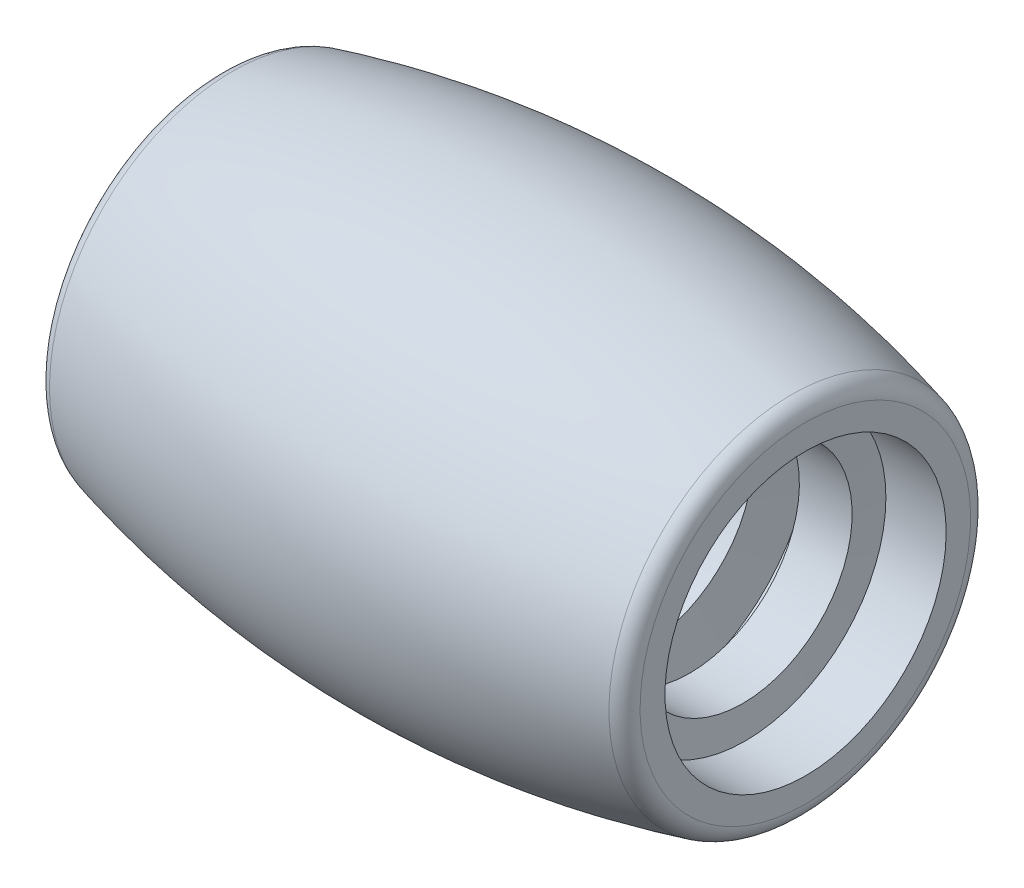
ISO-10303-21;
HEADER;
FILE_DESCRIPTION(('STEP AP214'),'2;1');
FILE_NAME('part.step','',(''),(''),'','','');
FILE_SCHEMA(('AUTOMOTIVE_DESIGN { 1 0 10303 214 1 1 1 1 }'));
ENDSEC;
DATA;
#1=APPLICATION_CONTEXT('core data for automotive mechanical design processes');
#2=APPLICATION_PROTOCOL_DEFINITION('international standard','automotive_design',2000,#1);
#3=PRODUCT_CONTEXT('',#1,'mechanical');
#4=PRODUCT('Part','Part','',(#3));
#5=PRODUCT_RELATED_PRODUCT_CATEGORY('part','',(#4));
#6=PRODUCT_DEFINITION_FORMATION('','',#4);
#7=PRODUCT_DEFINITION_CONTEXT('part definition',#1,'design');
#8=PRODUCT_DEFINITION('design','',#6,#7);
#9=PRODUCT_DEFINITION_SHAPE('','',#8);
#10=(LENGTH_UNIT() NAMED_UNIT(*) SI_UNIT(.MILLI.,.METRE.));
#11=(NAMED_UNIT(*) PLANE_ANGLE_UNIT() SI_UNIT($,.RADIAN.));
#12=(NAMED_UNIT(*) SI_UNIT($,.STERADIAN.) SOLID_ANGLE_UNIT());
#13=UNCERTAINTY_MEASURE_WITH_UNIT(LENGTH_MEASURE(1.E-05),#10,'distance_accuracy_value','');
#14=(GEOMETRIC_REPRESENTATION_CONTEXT(3) GLOBAL_UNCERTAINTY_ASSIGNED_CONTEXT((#13)) GLOBAL_UNIT_ASSIGNED_CONTEXT((#10,
#11,#12)) REPRESENTATION_CONTEXT('',''));
#15=CARTESIAN_POINT('',(0.,0.,0.));
#16=DIRECTION('',(0.,0.,1.));
#17=DIRECTION('',(1.,0.,0.));
#18=AXIS2_PLACEMENT_3D('',#15,#16,#17);
#19=CARTESIAN_POINT('',(-0.500000000009494,24.,0.));
#20=DIRECTION('',(1.,0.,0.));
#21=DIRECTION('',(0.,1.,0.));
#22=AXIS2_PLACEMENT_3D('',#19,#20,#21);
#23=CONICAL_SURFACE('',#22,4.49999999993486,1.48352986419883);
#24=CARTESIAN_POINT('',(-0.500000000000004,24.,0.));
#25=DIRECTION('',(-1.,0.,0.));
#26=DIRECTION('',(0.,-1.,0.));
#27=AXIS2_PLACEMENT_3D('',#24,#25,#26);
#28=CIRCLE('',#27,4.5);
#29=CARTESIAN_POINT('',(-0.500000000000002,19.5,0.));
#30=VERTEX_POINT('',#29);
#31=EDGE_CURVE('E19',#30,#30,#28,.F.);
#32=ORIENTED_EDGE('',*,*,#31,.T.);
#33=EDGE_LOOP('',(#32));
#34=FACE_BOUND('',#33,.T.);
#35=CARTESIAN_POINT('',(-0.63123299528889,24.,0.));
#36=DIRECTION('',(-1.,0.,0.));
#37=DIRECTION('',(0.,-1.,0.));
#38=AXIS2_PLACEMENT_3D('',#35,#36,#37);
#39=CIRCLE('',#38,3.);
#40=CARTESIAN_POINT('',(-0.631232995288888,21.,0.));
#41=VERTEX_POINT('',#40);
#42=EDGE_CURVE('E91',#41,#41,#39,.T.);
#43=ORIENTED_EDGE('',*,*,#42,.T.);
#44=EDGE_LOOP('',(#43));
#45=FACE_BOUND('',#44,.T.);
#46=ADVANCED_FACE('F15',(#34,#45),#23,.F.);
#47=CARTESIAN_POINT('',(0.,24.,0.));
#48=DIRECTION('',(-1.,0.,0.));
#49=DIRECTION('',(0.,-1.,0.));
#50=AXIS2_PLACEMENT_3D('',#47,#48,#49);
#51=CYLINDRICAL_SURFACE('',#50,4.5);
#52=CARTESIAN_POINT('',(0.500000000009494,24.,0.));
#53=DIRECTION('',(-1.,0.,0.));
#54=DIRECTION('',(0.,0.577765549497541,0.816202774936354));
#55=AXIS2_PLACEMENT_3D('',#52,#53,#54);
#56=CIRCLE('',#55,4.49999999993591);
#57=CARTESIAN_POINT('',(0.500000000009493,26.5999449727019,3.67291248716128));
#58=VERTEX_POINT('',#57);
#59=EDGE_CURVE('E89',#58,#58,#56,.F.);
#60=ORIENTED_EDGE('',*,*,#59,.T.);
#61=EDGE_LOOP('',(#60));
#62=FACE_BOUND('',#61,.T.);
#63=ORIENTED_EDGE('',*,*,#31,.F.);
#64=EDGE_LOOP('',(#63));
#65=FACE_BOUND('',#64,.T.);
#66=ADVANCED_FACE('F99',(#62,#65),#51,.F.);
#67=CARTESIAN_POINT('',(-2.05,24.,0.));
#68=DIRECTION('',(-1.,0.,0.));
#69=DIRECTION('',(0.,-1.,0.));
#70=AXIS2_PLACEMENT_3D('',#67,#68,#69);
#71=CYLINDRICAL_SURFACE('',#70,3.);
#72=ORIENTED_EDGE('',*,*,#42,.F.);
#73=EDGE_LOOP('',(#72));
#74=FACE_BOUND('',#73,.T.);
#75=CARTESIAN_POINT('',(-3.46876700471199,24.,0.));
#76=DIRECTION('',(-1.,0.,0.));
#77=DIRECTION('',(0.,0.577765549500587,0.816202774934198));
#78=AXIS2_PLACEMENT_3D('',#75,#76,#77);
#79=CIRCLE('',#78,2.99999999994198);
#80=CARTESIAN_POINT('',(-3.46876700471199,25.7332966484682,2.44860832475524));
#81=VERTEX_POINT('',#80);
#82=EDGE_CURVE('E86',#81,#81,#79,.T.);
#83=ORIENTED_EDGE('',*,*,#82,.T.);
#84=EDGE_LOOP('',(#83));
#85=FACE_BOUND('',#84,.T.);
#86=ADVANCED_FACE('F101',(#74,#85),#71,.F.);
#87=CARTESIAN_POINT('',(0.50000000003081,24.,0.));
#88=DIRECTION('',(-1.,0.,0.));
#89=DIRECTION('',(0.,-1.,0.));
#90=AXIS2_PLACEMENT_3D('',#87,#88,#89);
#91=CONICAL_SURFACE('',#90,4.49999999973104,1.48352986420108);
#92=ORIENTED_EDGE('',*,*,#59,.F.);
#93=EDGE_LOOP('',(#92));
#94=FACE_BOUND('',#93,.T.);
#95=CARTESIAN_POINT('',(0.631232995288883,24.,0.));
#96=DIRECTION('',(-1.,0.,0.));
#97=DIRECTION('',(0.,-1.,0.));
#98=AXIS2_PLACEMENT_3D('',#95,#96,#97);
#99=CIRCLE('',#98,3.);
#100=CARTESIAN_POINT('',(0.631232995288884,21.,0.));
#101=VERTEX_POINT('',#100);
#102=EDGE_CURVE('E83',#101,#101,#99,.F.);
#103=ORIENTED_EDGE('',*,*,#102,.T.);
#104=EDGE_LOOP('',(#103));
#105=FACE_BOUND('',#104,.T.);
#106=ADVANCED_FACE('F109',(#94,#105),#91,.F.);
#107=CARTESIAN_POINT('',(-3.59999999999871,24.,0.));
#108=DIRECTION('',(-1.,0.,0.));
#109=DIRECTION('',(0.,-1.,0.));
#110=AXIS2_PLACEMENT_3D('',#107,#108,#109);
#111=CONICAL_SURFACE('',#110,4.49999999993591,1.48352986419615);
#112=CARTESIAN_POINT('',(-3.6,24.,0.));
#113=DIRECTION('',(-1.,0.,0.));
#114=DIRECTION('',(0.,-1.,0.));
#115=AXIS2_PLACEMENT_3D('',#112,#113,#114);
#116=CIRCLE('',#115,4.5);
#117=CARTESIAN_POINT('',(-3.6,19.5,0.));
#118=VERTEX_POINT('',#117);
#119=EDGE_CURVE('E80',#118,#118,#116,.T.);
#120=ORIENTED_EDGE('',*,*,#119,.T.);
#121=EDGE_LOOP('',(#120));
#122=FACE_BOUND('',#121,.T.);
#123=ORIENTED_EDGE('',*,*,#82,.F.);
#124=EDGE_LOOP('',(#123));
#125=FACE_BOUND('',#124,.T.);
#126=ADVANCED_FACE('F186',(#122,#125),#111,.F.);
#127=CARTESIAN_POINT('',(2.05,24.,0.));
#128=DIRECTION('',(-1.,0.,0.));
#129=DIRECTION('',(0.,-1.,0.));
#130=AXIS2_PLACEMENT_3D('',#127,#128,#129);
#131=CYLINDRICAL_SURFACE('',#130,3.);
#132=ORIENTED_EDGE('',*,*,#102,.F.);
#133=EDGE_LOOP('',(#132));
#134=FACE_BOUND('',#133,.T.);
#135=CARTESIAN_POINT('',(3.46876700471199,24.,0.));
#136=DIRECTION('',(1.,0.,0.));
#137=DIRECTION('',(0.,-0.577765549500183,-0.816202774934484));
#138=AXIS2_PLACEMENT_3D('',#135,#136,#137);
#139=CIRCLE('',#138,2.99999999994093);
#140=CARTESIAN_POINT('',(3.46876700471199,22.2667033515336,-2.44860832475524));
#141=VERTEX_POINT('',#140);
#142=EDGE_CURVE('E77',#141,#141,#139,.T.);
#143=ORIENTED_EDGE('',*,*,#142,.T.);
#144=EDGE_LOOP('',(#143));
#145=FACE_BOUND('',#144,.T.);
#146=ADVANCED_FACE('F182',(#134,#145),#131,.F.);
#147=CARTESIAN_POINT('',(-4.1,24.,0.));
#148=DIRECTION('',(-1.,0.,0.));
#149=DIRECTION('',(0.,-1.,0.));
#150=AXIS2_PLACEMENT_3D('',#147,#148,#149);
#151=CYLINDRICAL_SURFACE('',#150,4.5);
#152=CARTESIAN_POINT('',(-4.60000000000349,24.,0.));
#153=DIRECTION('',(1.,0.,0.));
#154=DIRECTION('',(0.,-0.577765549497271,-0.816202774936545));
#155=AXIS2_PLACEMENT_3D('',#152,#153,#154);
#156=CIRCLE('',#155,4.49999999993486);
#157=CARTESIAN_POINT('',(-4.60000000000349,21.4000550272999,-3.67291248716128));
#158=VERTEX_POINT('',#157);
#159=EDGE_CURVE('E74',#158,#158,#156,.F.);
#160=ORIENTED_EDGE('',*,*,#159,.T.);
#161=EDGE_LOOP('',(#160));
#162=FACE_BOUND('',#161,.T.);
#163=ORIENTED_EDGE('',*,*,#119,.F.);
#164=EDGE_LOOP('',(#163));
#165=FACE_BOUND('',#164,.T.);
#166=ADVANCED_FACE('F178',(#162,#165),#151,.F.);
#167=CARTESIAN_POINT('',(3.60000000001293,24.,0.));
#168=DIRECTION('',(1.,0.,0.));
#169=DIRECTION('',(0.,1.,0.));
#170=AXIS2_PLACEMENT_3D('',#167,#168,#169);
#171=CONICAL_SURFACE('',#170,4.50000000009334,1.48352986419592);
#172=ORIENTED_EDGE('',*,*,#142,.F.);
#173=EDGE_LOOP('',(#172));
#174=FACE_BOUND('',#173,.T.);
#175=CARTESIAN_POINT('',(3.6,24.,0.));
#176=DIRECTION('',(-1.,0.,0.));
#177=DIRECTION('',(0.,-1.,0.));
#178=AXIS2_PLACEMENT_3D('',#175,#176,#177);
#179=CIRCLE('',#178,4.5);
#180=CARTESIAN_POINT('',(3.6,19.5,0.));
#181=VERTEX_POINT('',#180);
#182=EDGE_CURVE('E71',#181,#181,#179,.F.);
#183=ORIENTED_EDGE('',*,*,#182,.T.);
#184=EDGE_LOOP('',(#183));
#185=FACE_BOUND('',#184,.T.);
#186=ADVANCED_FACE('F174',(#174,#185),#171,.F.);
#187=CARTESIAN_POINT('',(-4.60000000000349,24.,0.));
#188=DIRECTION('',(1.,0.,0.));
#189=DIRECTION('',(0.,1.,0.));
#190=AXIS2_PLACEMENT_3D('',#187,#188,#189);
#191=CONICAL_SURFACE('',#190,4.49999999993486,1.48352986419144);
#192=ORIENTED_EDGE('',*,*,#159,.F.);
#193=EDGE_LOOP('',(#192));
#194=FACE_BOUND('',#193,.T.);
#195=CARTESIAN_POINT('',(-4.73123299528888,24.,0.));
#196=DIRECTION('',(-1.,0.,0.));
#197=DIRECTION('',(0.,-1.,0.));
#198=AXIS2_PLACEMENT_3D('',#195,#196,#197);
#199=CIRCLE('',#198,3.);
#200=CARTESIAN_POINT('',(-4.73123299528888,21.,0.));
#201=VERTEX_POINT('',#200);
#202=EDGE_CURVE('E68',#201,#201,#199,.T.);
#203=ORIENTED_EDGE('',*,*,#202,.T.);
#204=EDGE_LOOP('',(#203));
#205=FACE_BOUND('',#204,.T.);
#206=ADVANCED_FACE('F170',(#194,#205),#191,.F.);
#207=CARTESIAN_POINT('',(4.1,24.,0.));
#208=DIRECTION('',(-1.,0.,0.));
#209=DIRECTION('',(0.,-1.,0.));
#210=AXIS2_PLACEMENT_3D('',#207,#208,#209);
#211=CYLINDRICAL_SURFACE('',#210,4.5);
#212=CARTESIAN_POINT('',(4.60000000000349,24.,0.));
#213=DIRECTION('',(-1.,0.,0.));
#214=DIRECTION('',(0.,0.57776554949754,0.816202774936354));
#215=AXIS2_PLACEMENT_3D('',#212,#213,#214);
#216=CIRCLE('',#215,4.49999999993591);
#217=CARTESIAN_POINT('',(4.60000000000349,26.5999449727019,3.67291248716128));
#218=VERTEX_POINT('',#217);
#219=EDGE_CURVE('E65',#218,#218,#216,.F.);
#220=ORIENTED_EDGE('',*,*,#219,.T.);
#221=EDGE_LOOP('',(#220));
#222=FACE_BOUND('',#221,.T.);
#223=ORIENTED_EDGE('',*,*,#182,.F.);
#224=EDGE_LOOP('',(#223));
#225=FACE_BOUND('',#224,.T.);
#226=ADVANCED_FACE('F166',(#222,#225),#211,.F.);
#227=CARTESIAN_POINT('',(-5.45343381564592,24.,0.));
#228=DIRECTION('',(-1.,0.,0.));
#229=DIRECTION('',(0.,-1.,0.));
#230=AXIS2_PLACEMENT_3D('',#227,#228,#229);
#231=CYLINDRICAL_SURFACE('',#230,3.);
#232=ORIENTED_EDGE('',*,*,#202,.F.);
#233=EDGE_LOOP('',(#232));
#234=FACE_BOUND('',#233,.T.);
#235=CARTESIAN_POINT('',(-6.17563463599424,24.,0.));
#236=DIRECTION('',(-1.,0.,0.));
#237=DIRECTION('',(0.,0.577765549491652,0.816202774940523));
#238=AXIS2_PLACEMENT_3D('',#235,#236,#237);
#239=CIRCLE('',#238,2.99999999998838);
#240=CARTESIAN_POINT('',(-6.17563463599424,25.7332966484682,2.44860832481208));
#241=VERTEX_POINT('',#240);
#242=EDGE_CURVE('E62',#241,#241,#239,.T.);
#243=ORIENTED_EDGE('',*,*,#242,.T.);
#244=EDGE_LOOP('',(#243));
#245=FACE_BOUND('',#244,.T.);
#246=ADVANCED_FACE('F162',(#234,#245),#231,.F.);
#247=CARTESIAN_POINT('',(4.60000000000349,24.,0.));
#248=DIRECTION('',(-1.,0.,0.));
#249=DIRECTION('',(0.,-1.,0.));
#250=AXIS2_PLACEMENT_3D('',#247,#248,#249);
#251=CONICAL_SURFACE('',#250,4.49999999993591,1.48352986419144);
#252=ORIENTED_EDGE('',*,*,#219,.F.);
#253=EDGE_LOOP('',(#252));
#254=FACE_BOUND('',#253,.T.);
#255=CARTESIAN_POINT('',(4.73123299528889,24.,0.));
#256=DIRECTION('',(-1.,0.,0.));
#257=DIRECTION('',(0.,-1.,0.));
#258=AXIS2_PLACEMENT_3D('',#255,#256,#257);
#259=CIRCLE('',#258,3.);
#260=CARTESIAN_POINT('',(4.73123299528889,21.,0.));
#261=VERTEX_POINT('',#260);
#262=EDGE_CURVE('E59',#261,#261,#259,.F.);
#263=ORIENTED_EDGE('',*,*,#262,.T.);
#264=EDGE_LOOP('',(#263));
#265=FACE_BOUND('',#264,.T.);
#266=ADVANCED_FACE('F158',(#254,#265),#251,.F.);
#267=CARTESIAN_POINT('',(-6.24999999998721,24.,0.));
#268=DIRECTION('',(-1.,0.,0.));
#269=DIRECTION('',(0.,-1.,0.));
#270=AXIS2_PLACEMENT_3D('',#267,#268,#269);
#271=CONICAL_SURFACE('',#270,3.84999999999493,1.4835298642006);
#272=CARTESIAN_POINT('',(-6.25,24.,0.));
#273=DIRECTION('',(-1.,0.,0.));
#274=DIRECTION('',(0.,-1.,0.));
#275=AXIS2_PLACEMENT_3D('',#272,#273,#274);
#276=CIRCLE('',#275,3.85);
#277=CARTESIAN_POINT('',(-6.25,20.15,0.));
#278=VERTEX_POINT('',#277);
#279=EDGE_CURVE('E56',#278,#278,#276,.T.);
#280=ORIENTED_EDGE('',*,*,#279,.T.);
#281=EDGE_LOOP('',(#280));
#282=FACE_BOUND('',#281,.T.);
#283=ORIENTED_EDGE('',*,*,#242,.F.);
#284=EDGE_LOOP('',(#283));
#285=FACE_BOUND('',#284,.T.);
#286=ADVANCED_FACE('F154',(#282,#285),#271,.F.);
#287=CARTESIAN_POINT('',(5.45343381564592,24.,0.));
#288=DIRECTION('',(-1.,0.,0.));
#289=DIRECTION('',(0.,-1.,0.));
#290=AXIS2_PLACEMENT_3D('',#287,#288,#289);
#291=CYLINDRICAL_SURFACE('',#290,3.);
#292=ORIENTED_EDGE('',*,*,#262,.F.);
#293=EDGE_LOOP('',(#292));
#294=FACE_BOUND('',#293,.T.);
#295=CARTESIAN_POINT('',(6.17563463599424,24.,0.));
#296=DIRECTION('',(1.,0.,0.));
#297=DIRECTION('',(0.,-0.577765549487561,-0.816202774943419));
#298=AXIS2_PLACEMENT_3D('',#295,#296,#297);
#299=CIRCLE('',#298,2.99999999990809);
#300=CARTESIAN_POINT('',(6.17563463599424,22.2667033515904,-2.44860832475524));
#301=VERTEX_POINT('',#300);
#302=EDGE_CURVE('E53',#301,#301,#299,.T.);
#303=ORIENTED_EDGE('',*,*,#302,.T.);
#304=EDGE_LOOP('',(#303));
#305=FACE_BOUND('',#304,.T.);
#306=ADVANCED_FACE('F150',(#294,#305),#291,.F.);
#307=CARTESIAN_POINT('',(-6.71387324356678,24.,0.));
#308=DIRECTION('',(-1.,0.,0.));
#309=DIRECTION('',(0.,-1.,0.));
#310=AXIS2_PLACEMENT_3D('',#307,#308,#309);
#311=CYLINDRICAL_SURFACE('',#310,3.85);
#312=CARTESIAN_POINT('',(-7.17774648713831,24.,0.));
#313=DIRECTION('',(1.,0.,0.));
#314=DIRECTION('',(0.,-0.577765549497167,-0.816202774936619));
#315=AXIS2_PLACEMENT_3D('',#312,#313,#314);
#316=CIRCLE('',#315,3.85000000002672);
#317=CARTESIAN_POINT('',(-7.17774648713831,21.7756026344205,-3.14238068352779));
#318=VERTEX_POINT('',#317);
#319=EDGE_CURVE('E50',#318,#318,#316,.F.);
#320=ORIENTED_EDGE('',*,*,#319,.T.);
#321=EDGE_LOOP('',(#320));
#322=FACE_BOUND('',#321,.T.);
#323=ORIENTED_EDGE('',*,*,#279,.F.);
#324=EDGE_LOOP('',(#323));
#325=FACE_BOUND('',#324,.T.);
#326=ADVANCED_FACE('F146',(#322,#325),#311,.F.);
#327=CARTESIAN_POINT('',(6.24999999999431,24.,0.));
#328=DIRECTION('',(1.,0.,0.));
#329=DIRECTION('',(0.,1.,0.));
#330=AXIS2_PLACEMENT_3D('',#327,#328,#329);
#331=CONICAL_SURFACE('',#330,3.84999999999388,1.4835298642004);
#332=CARTESIAN_POINT('',(6.25,24.,0.));
#333=DIRECTION('',(-1.,0.,0.));
#334=DIRECTION('',(0.,-1.,0.));
#335=AXIS2_PLACEMENT_3D('',#332,#333,#334);
#336=CIRCLE('',#335,3.85000000000001);
#337=CARTESIAN_POINT('',(6.25,20.15,0.));
#338=VERTEX_POINT('',#337);
#339=EDGE_CURVE('E47',#338,#338,#336,.F.);
#340=ORIENTED_EDGE('',*,*,#339,.T.);
#341=EDGE_LOOP('',(#340));
#342=FACE_BOUND('',#341,.T.);
#343=ORIENTED_EDGE('',*,*,#302,.F.);
#344=EDGE_LOOP('',(#343));
#345=FACE_BOUND('',#344,.T.);
#346=ADVANCED_FACE('F142',(#342,#345),#331,.F.);
#347=CARTESIAN_POINT('',(-7.17774648713831,24.,0.));
#348=DIRECTION('',(1.,0.,0.));
#349=DIRECTION('',(0.,1.,0.));
#350=AXIS2_PLACEMENT_3D('',#347,#348,#349);
#351=CONICAL_SURFACE('',#350,3.85000000002672,1.5620696805395);
#352=ORIENTED_EDGE('',*,*,#319,.F.);
#353=EDGE_LOOP('',(#352));
#354=FACE_BOUND('',#353,.T.);
#355=CARTESIAN_POINT('',(-7.19520022271509,24.,0.));
#356=DIRECTION('',(-1.,0.,0.));
#357=DIRECTION('',(0.,-1.,0.));
#358=AXIS2_PLACEMENT_3D('',#355,#356,#357);
#359=CIRCLE('',#358,1.85);
#360=CARTESIAN_POINT('',(-7.19520022271509,22.15,0.));
#361=VERTEX_POINT('',#360);
#362=EDGE_CURVE('E44',#361,#361,#359,.T.);
#363=ORIENTED_EDGE('',*,*,#362,.T.);
#364=EDGE_LOOP('',(#363));
#365=FACE_BOUND('',#364,.T.);
#366=ADVANCED_FACE('F138',(#354,#365),#351,.F.);
#367=CARTESIAN_POINT('',(7.075,24.,0.));
#368=DIRECTION('',(-1.,0.,0.));
#369=DIRECTION('',(0.,-1.,0.));
#370=AXIS2_PLACEMENT_3D('',#367,#368,#369);
#371=CYLINDRICAL_SURFACE('',#370,3.85000000000001);
#372=ORIENTED_EDGE('',*,*,#339,.F.);
#373=EDGE_LOOP('',(#372));
#374=FACE_BOUND('',#373,.T.);
#375=CARTESIAN_POINT('',(7.89999999999758,24.,0.));
#376=DIRECTION('',(-1.,0.,0.));
#377=DIRECTION('',(0.,0.577765549497482,0.816202774936396));
#378=AXIS2_PLACEMENT_3D('',#375,#376,#377);
#379=CIRCLE('',#378,3.85000000002777);
#380=CARTESIAN_POINT('',(7.89999999999758,26.2243973655814,3.14238068352779));
#381=VERTEX_POINT('',#380);
#382=EDGE_CURVE('E41',#381,#381,#379,.T.);
#383=ORIENTED_EDGE('',*,*,#382,.F.);
#384=EDGE_LOOP('',(#383));
#385=FACE_BOUND('',#384,.T.);
#386=ADVANCED_FACE('F134',(#374,#385),#371,.F.);
#387=CARTESIAN_POINT('',(-7.69520022271509,24.,0.));
#388=DIRECTION('',(-1.,0.,0.));
#389=DIRECTION('',(0.,-1.,0.));
#390=AXIS2_PLACEMENT_3D('',#387,#388,#389);
#391=CYLINDRICAL_SURFACE('',#390,1.85);
#392=ORIENTED_EDGE('',*,*,#362,.F.);
#393=EDGE_LOOP('',(#392));
#394=FACE_BOUND('',#393,.T.);
#395=CARTESIAN_POINT('',(-8.19520022270837,24.,0.));
#396=DIRECTION('',(1.,0.,0.));
#397=DIRECTION('',(0.,-0.577765549493382,-0.816202774939298));
#398=AXIS2_PLACEMENT_3D('',#395,#396,#397);
#399=CIRCLE('',#398,1.84999999990275);
#400=CARTESIAN_POINT('',(-8.19520022270837,22.9311337334934,-1.50997513355833));
#401=VERTEX_POINT('',#400);
#402=EDGE_CURVE('E38',#401,#401,#399,.T.);
#403=ORIENTED_EDGE('',*,*,#402,.F.);
#404=EDGE_LOOP('',(#403));
#405=FACE_BOUND('',#404,.T.);
#406=ADVANCED_FACE('F130',(#394,#405),#391,.F.);
#407=CARTESIAN_POINT('',(7.89409753136727,24.,0.));
#408=DIRECTION('',(-1.,0.,0.));
#409=DIRECTION('',(0.,-1.,0.));
#410=AXIS2_PLACEMENT_3D('',#407,#408,#409);
#411=CONICAL_SURFACE('',#410,4.52635591323686,1.56206968054082);
#412=ORIENTED_EDGE('',*,*,#382,.T.);
#413=EDGE_LOOP('',(#412));
#414=FACE_BOUND('',#413,.T.);
#415=CARTESIAN_POINT('',(7.89409753136414,24.,0.));
#416=DIRECTION('',(-1.,0.,0.));
#417=DIRECTION('',(0.,-0.577765549498243,-0.816202774935857));
#418=AXIS2_PLACEMENT_3D('',#415,#416,#417);
#419=CIRCLE('',#418,4.52635591341328);
#420=CARTESIAN_POINT('',(7.89409753136415,21.3848274884622,-3.69442425687525));
#421=VERTEX_POINT('',#420);
#422=EDGE_CURVE('E35',#421,#421,#419,.T.);
#423=ORIENTED_EDGE('',*,*,#422,.F.);
#424=EDGE_LOOP('',(#423));
#425=FACE_BOUND('',#424,.T.);
#426=ADVANCED_FACE('F126',(#414,#425),#411,.T.);
#427=CARTESIAN_POINT('',(-8.17184401849947,24.,0.));
#428=DIRECTION('',(1.,0.,0.));
#429=DIRECTION('',(0.,1.,0.));
#430=AXIS2_PLACEMENT_3D('',#427,#428,#429);
#431=CONICAL_SURFACE('',#430,4.52635591397606,1.56206968054017);
#432=ORIENTED_EDGE('',*,*,#402,.T.);
#433=EDGE_LOOP('',(#432));
#434=FACE_BOUND('',#433,.T.);
#435=CARTESIAN_POINT('',(-8.17184401849288,24.,0.));
#436=DIRECTION('',(1.,0.,0.));
#437=DIRECTION('',(0.,-0.577765549498242,-0.816202774935858));
#438=AXIS2_PLACEMENT_3D('',#435,#436,#437);
#439=CIRCLE('',#438,4.52635591396764);
#440=CARTESIAN_POINT('',(-8.17184401849288,21.3848274881419,-3.69442425732772));
#441=VERTEX_POINT('',#440);
#442=EDGE_CURVE('E28',#441,#441,#439,.T.);
#443=ORIENTED_EDGE('',*,*,#442,.F.);
#444=EDGE_LOOP('',(#443));
#445=FACE_BOUND('',#444,.T.);
#446=ADVANCED_FACE('F123',(#434,#445),#431,.T.);
#447=CARTESIAN_POINT('',(7.3941165698333,24.,0.));
#448=DIRECTION('',(-1.,0.,0.));
#449=DIRECTION('',(0.,-1.,0.));
#450=AXIS2_PLACEMENT_3D('',#447,#448,#449);
#451=TOROIDAL_SURFACE('',#450,4.521992645522,0.499999999999998);
#452=ORIENTED_EDGE('',*,*,#422,.T.);
#453=EDGE_LOOP('',(#452));
#454=FACE_BOUND('',#453,.T.);
#455=CARTESIAN_POINT('',(7.52179436328076,24.,0.));
#456=DIRECTION('',(-1.,0.,0.));
#457=DIRECTION('',(0.,0.577765549498242,0.816202774935857));
#458=AXIS2_PLACEMENT_3D('',#455,#456,#457);
#459=CIRCLE('',#458,5.0054162496834);
#460=CARTESIAN_POINT('',(7.52179436328076,26.8919570699658,4.08543463270063));
#461=VERTEX_POINT('',#460);
#462=EDGE_CURVE('E23',#461,#461,#459,.T.);
#463=ORIENTED_EDGE('',*,*,#462,.F.);
#464=EDGE_LOOP('',(#463));
#465=FACE_BOUND('',#464,.T.);
#466=ADVANCED_FACE('F120',(#454,#465),#451,.T.);
#467=CARTESIAN_POINT('',(-7.67186305696688,24.,0.));
#468=DIRECTION('',(-1.,0.,0.));
#469=DIRECTION('',(0.,-1.,0.));
#470=AXIS2_PLACEMENT_3D('',#467,#468,#469);
#471=TOROIDAL_SURFACE('',#470,4.521992645522,0.499999999999997);
#472=ORIENTED_EDGE('',*,*,#442,.T.);
#473=EDGE_LOOP('',(#472));
#474=FACE_BOUND('',#473,.T.);
#475=CARTESIAN_POINT('',(-7.79954085041433,24.,0.));
#476=DIRECTION('',(-1.,0.,0.));
#477=DIRECTION('',(0.,0.577765549498242,0.816202774935857));
#478=AXIS2_PLACEMENT_3D('',#475,#476,#477);
#479=CIRCLE('',#478,5.0054162496834);
#480=CARTESIAN_POINT('',(-7.79954085041433,26.8919570699658,4.08543463270063));
#481=VERTEX_POINT('',#480);
#482=EDGE_CURVE('E10',#481,#481,#479,.F.);
#483=ORIENTED_EDGE('',*,*,#482,.F.);
#484=EDGE_LOOP('',(#483));
#485=FACE_BOUND('',#484,.T.);
#486=ADVANCED_FACE('F17',(#474,#485),#471,.T.);
#487=CARTESIAN_POINT('',(-0.138873243566783,10.1336268120421,-19.5888665984607));
#488=DIRECTION('',(0.,0.816202774935857,-0.577765549498242));
#489=DIRECTION('',(0.,0.577765549498242,0.816202774935857));
#490=AXIS2_PLACEMENT_3D('',#487,#488,#489);
#491=CIRCLE('',#490,30.0000000000002);
#492=TRIMMED_CURVE('',#491,(PARAMETER_VALUE(-0.643501108793283)),
(PARAMETER_VALUE(0.643501108793284)),.T.,.PARAMETER.);
#493=CARTESIAN_POINT('',(-0.138873243566788,24.,0.));
#494=DIRECTION('',(-1.,0.,0.));
#495=AXIS1_PLACEMENT('',#493,#494);
#496=SURFACE_OF_REVOLUTION('',#492,#495);
#497=ORIENTED_EDGE('',*,*,#462,.T.);
#498=EDGE_LOOP('',(#497));
#499=FACE_BOUND('',#498,.T.);
#500=ORIENTED_EDGE('',*,*,#482,.T.);
#501=EDGE_LOOP('',(#500));
#502=FACE_BOUND('',#501,.T.);
#503=ADVANCED_FACE('F113',(#499,#502),#496,.F.);
#504=CLOSED_SHELL('',(#46,#66,#86,#106,#126,#146,#166,#186,#206,#226,#246,#266,#286,#306,#326,
#346,#366,#386,#406,#426,#446,#466,#486,#503));
#505=MANIFOLD_SOLID_BREP('B1',#504);
#506=ADVANCED_BREP_SHAPE_REPRESENTATION('',(#18,#505),#14);
#507=SHAPE_DEFINITION_REPRESENTATION(#9,#506);
ENDSEC;
END-ISO-10303-21;
